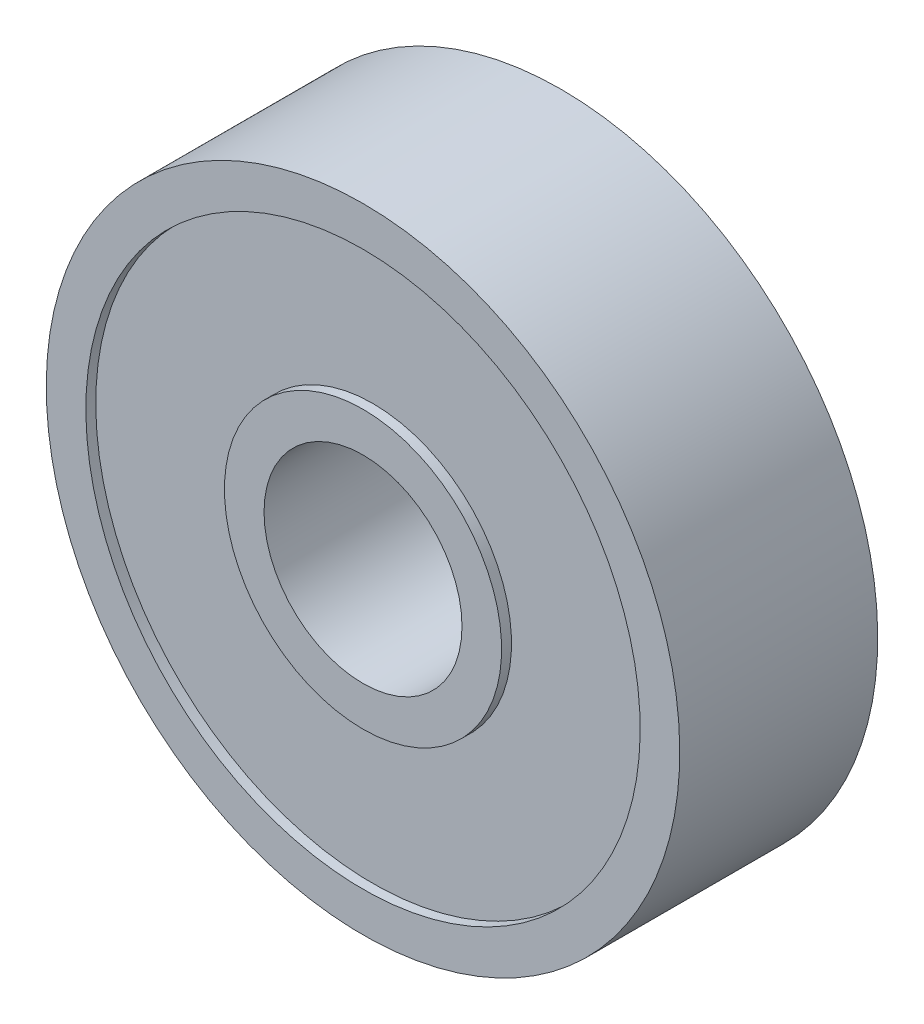
ISO-10303-21;
HEADER;
FILE_DESCRIPTION(('STEP AP214'),'2;1');
FILE_NAME('part.step','',(''),(''),'','','');
FILE_SCHEMA(('AUTOMOTIVE_DESIGN { 1 0 10303 214 1 1 1 1 }'));
ENDSEC;
DATA;
#1=APPLICATION_CONTEXT('core data for automotive mechanical design processes');
#2=APPLICATION_PROTOCOL_DEFINITION('international standard','automotive_design',2000,#1);
#3=PRODUCT_CONTEXT('',#1,'mechanical');
#4=PRODUCT('Part','Part','',(#3));
#5=PRODUCT_RELATED_PRODUCT_CATEGORY('part','',(#4));
#6=PRODUCT_DEFINITION_FORMATION('','',#4);
#7=PRODUCT_DEFINITION_CONTEXT('part definition',#1,'design');
#8=PRODUCT_DEFINITION('design','',#6,#7);
#9=PRODUCT_DEFINITION_SHAPE('','',#8);
#10=(LENGTH_UNIT() NAMED_UNIT(*) SI_UNIT(.MILLI.,.METRE.));
#11=(NAMED_UNIT(*) PLANE_ANGLE_UNIT() SI_UNIT($,.RADIAN.));
#12=(NAMED_UNIT(*) SI_UNIT($,.STERADIAN.) SOLID_ANGLE_UNIT());
#13=UNCERTAINTY_MEASURE_WITH_UNIT(LENGTH_MEASURE(1.E-05),#10,'distance_accuracy_value','');
#14=(GEOMETRIC_REPRESENTATION_CONTEXT(3) GLOBAL_UNCERTAINTY_ASSIGNED_CONTEXT((#13)) GLOBAL_UNIT_ASSIGNED_CONTEXT((#10,
#11,#12)) REPRESENTATION_CONTEXT('',''));
#15=CARTESIAN_POINT('',(0.,0.,0.));
#16=DIRECTION('',(0.,0.,1.));
#17=DIRECTION('',(1.,0.,0.));
#18=AXIS2_PLACEMENT_3D('',#15,#16,#17);
#19=CARTESIAN_POINT('',(0.,0.,2.5));
#20=DIRECTION('',(0.,0.,-1.));
#21=DIRECTION('',(0.,1.,0.));
#22=AXIS2_PLACEMENT_3D('',#19,#20,#21);
#23=CYLINDRICAL_SURFACE('',#22,2.5);
#24=CARTESIAN_POINT('',(0.,0.,0.));
#25=DIRECTION('',(0.,0.,-1.));
#26=DIRECTION('',(1.,0.,0.));
#27=AXIS2_PLACEMENT_3D('',#24,#25,#26);
#28=CIRCLE('',#27,2.5);
#29=CARTESIAN_POINT('',(0.,2.5,0.));
#30=VERTEX_POINT('',#29);
#31=EDGE_CURVE('E11',#30,#30,#28,.T.);
#32=ORIENTED_EDGE('',*,*,#31,.T.);
#33=EDGE_LOOP('',(#32));
#34=FACE_BOUND('',#33,.T.);
#35=CARTESIAN_POINT('',(0.,0.,5.));
#36=DIRECTION('',(0.,0.,-1.));
#37=DIRECTION('',(1.,0.,0.));
#38=AXIS2_PLACEMENT_3D('',#35,#36,#37);
#39=CIRCLE('',#38,2.5);
#40=CARTESIAN_POINT('',(0.,2.5,5.));
#41=VERTEX_POINT('',#40);
#42=EDGE_CURVE('E90',#41,#41,#39,.T.);
#43=ORIENTED_EDGE('',*,*,#42,.F.);
#44=EDGE_LOOP('',(#43));
#45=FACE_BOUND('',#44,.T.);
#46=ADVANCED_FACE('F17',(#34,#45),#23,.F.);
#47=CARTESIAN_POINT('',(0.,2.5,0.));
#48=DIRECTION('',(0.,0.,-1.));
#49=DIRECTION('',(0.,-1.,0.));
#50=AXIS2_PLACEMENT_3D('',#47,#48,#49);
#51=PLANE('',#50);
#52=CARTESIAN_POINT('',(0.,0.,0.));
#53=DIRECTION('',(0.,0.,-1.));
#54=DIRECTION('',(1.,0.,0.));
#55=AXIS2_PLACEMENT_3D('',#52,#53,#54);
#56=CIRCLE('',#55,3.5);
#57=CARTESIAN_POINT('',(0.,3.5,0.));
#58=VERTEX_POINT('',#57);
#59=EDGE_CURVE('E27',#58,#58,#56,.T.);
#60=ORIENTED_EDGE('',*,*,#59,.T.);
#61=EDGE_LOOP('',(#60));
#62=FACE_BOUND('',#61,.T.);
#63=ORIENTED_EDGE('',*,*,#31,.F.);
#64=EDGE_LOOP('',(#63));
#65=FACE_BOUND('',#64,.T.);
#66=ADVANCED_FACE('F122',(#62,#65),#51,.T.);
#67=CARTESIAN_POINT('',(0.,0.,0.125));
#68=DIRECTION('',(0.,0.,-1.));
#69=DIRECTION('',(0.,1.,0.));
#70=AXIS2_PLACEMENT_3D('',#67,#68,#69);
#71=CYLINDRICAL_SURFACE('',#70,3.5);
#72=CARTESIAN_POINT('',(0.,0.,0.25));
#73=DIRECTION('',(0.,0.,-1.));
#74=DIRECTION('',(1.,0.,0.));
#75=AXIS2_PLACEMENT_3D('',#72,#73,#74);
#76=CIRCLE('',#75,3.5);
#77=CARTESIAN_POINT('',(0.,3.5,0.25));
#78=VERTEX_POINT('',#77);
#79=EDGE_CURVE('E53',#78,#78,#76,.T.);
#80=ORIENTED_EDGE('',*,*,#79,.T.);
#81=EDGE_LOOP('',(#80));
#82=FACE_BOUND('',#81,.T.);
#83=ORIENTED_EDGE('',*,*,#59,.F.);
#84=EDGE_LOOP('',(#83));
#85=FACE_BOUND('',#84,.T.);
#86=ADVANCED_FACE('F54',(#82,#85),#71,.T.);
#87=CARTESIAN_POINT('',(0.,3.5,0.25));
#88=DIRECTION('',(0.,0.,-1.));
#89=DIRECTION('',(0.,-1.,0.));
#90=AXIS2_PLACEMENT_3D('',#87,#88,#89);
#91=PLANE('',#90);
#92=CARTESIAN_POINT('',(0.,0.,0.25));
#93=DIRECTION('',(0.,0.,-1.));
#94=DIRECTION('',(1.,0.,0.));
#95=AXIS2_PLACEMENT_3D('',#92,#93,#94);
#96=CIRCLE('',#95,7.);
#97=CARTESIAN_POINT('',(0.,7.,0.25));
#98=VERTEX_POINT('',#97);
#99=EDGE_CURVE('E56',#98,#98,#96,.T.);
#100=ORIENTED_EDGE('',*,*,#99,.T.);
#101=EDGE_LOOP('',(#100));
#102=FACE_BOUND('',#101,.T.);
#103=ORIENTED_EDGE('',*,*,#79,.F.);
#104=EDGE_LOOP('',(#103));
#105=FACE_BOUND('',#104,.T.);
#106=ADVANCED_FACE('F172',(#102,#105),#91,.T.);
#107=CARTESIAN_POINT('',(0.,0.,0.125000000000002));
#108=DIRECTION('',(0.,0.,-1.));
#109=DIRECTION('',(0.,1.,0.));
#110=AXIS2_PLACEMENT_3D('',#107,#108,#109);
#111=CYLINDRICAL_SURFACE('',#110,7.);
#112=CARTESIAN_POINT('',(0.,0.,0.));
#113=DIRECTION('',(0.,0.,-1.));
#114=DIRECTION('',(1.,0.,0.));
#115=AXIS2_PLACEMENT_3D('',#112,#113,#114);
#116=CIRCLE('',#115,7.);
#117=CARTESIAN_POINT('',(0.,7.,0.));
#118=VERTEX_POINT('',#117);
#119=EDGE_CURVE('E67',#118,#118,#116,.T.);
#120=ORIENTED_EDGE('',*,*,#119,.T.);
#121=EDGE_LOOP('',(#120));
#122=FACE_BOUND('',#121,.T.);
#123=ORIENTED_EDGE('',*,*,#99,.F.);
#124=EDGE_LOOP('',(#123));
#125=FACE_BOUND('',#124,.T.);
#126=ADVANCED_FACE('F166',(#122,#125),#111,.F.);
#127=CARTESIAN_POINT('',(0.,7.,0.));
#128=DIRECTION('',(0.,0.,-1.));
#129=DIRECTION('',(0.,-1.,0.));
#130=AXIS2_PLACEMENT_3D('',#127,#128,#129);
#131=PLANE('',#130);
#132=CARTESIAN_POINT('',(0.,0.,0.));
#133=DIRECTION('',(0.,0.,-1.));
#134=DIRECTION('',(1.,0.,0.));
#135=AXIS2_PLACEMENT_3D('',#132,#133,#134);
#136=CIRCLE('',#135,8.);
#137=CARTESIAN_POINT('',(0.,8.,0.));
#138=VERTEX_POINT('',#137);
#139=EDGE_CURVE('E73',#138,#138,#136,.T.);
#140=ORIENTED_EDGE('',*,*,#139,.T.);
#141=EDGE_LOOP('',(#140));
#142=FACE_BOUND('',#141,.T.);
#143=ORIENTED_EDGE('',*,*,#119,.F.);
#144=EDGE_LOOP('',(#143));
#145=FACE_BOUND('',#144,.T.);
#146=ADVANCED_FACE('F162',(#142,#145),#131,.T.);
#147=CARTESIAN_POINT('',(0.,0.,2.5));
#148=DIRECTION('',(0.,0.,-1.));
#149=DIRECTION('',(0.,1.,0.));
#150=AXIS2_PLACEMENT_3D('',#147,#148,#149);
#151=CYLINDRICAL_SURFACE('',#150,8.);
#152=CARTESIAN_POINT('',(0.,0.,5.));
#153=DIRECTION('',(0.,0.,-1.));
#154=DIRECTION('',(1.,0.,0.));
#155=AXIS2_PLACEMENT_3D('',#152,#153,#154);
#156=CIRCLE('',#155,8.);
#157=CARTESIAN_POINT('',(0.,8.,5.));
#158=VERTEX_POINT('',#157);
#159=EDGE_CURVE('E66',#158,#158,#156,.T.);
#160=ORIENTED_EDGE('',*,*,#159,.T.);
#161=EDGE_LOOP('',(#160));
#162=FACE_BOUND('',#161,.T.);
#163=ORIENTED_EDGE('',*,*,#139,.F.);
#164=EDGE_LOOP('',(#163));
#165=FACE_BOUND('',#164,.T.);
#166=ADVANCED_FACE('F149',(#162,#165),#151,.T.);
#167=CARTESIAN_POINT('',(0.,8.,5.));
#168=DIRECTION('',(0.,0.,1.));
#169=DIRECTION('',(1.,0.,0.));
#170=AXIS2_PLACEMENT_3D('',#167,#168,#169);
#171=PLANE('',#170);
#172=CARTESIAN_POINT('',(0.,0.,5.));
#173=DIRECTION('',(0.,0.,-1.));
#174=DIRECTION('',(1.,0.,0.));
#175=AXIS2_PLACEMENT_3D('',#172,#173,#174);
#176=CIRCLE('',#175,7.);
#177=CARTESIAN_POINT('',(0.,7.,5.));
#178=VERTEX_POINT('',#177);
#179=EDGE_CURVE('E72',#178,#178,#176,.T.);
#180=ORIENTED_EDGE('',*,*,#179,.T.);
#181=EDGE_LOOP('',(#180));
#182=FACE_BOUND('',#181,.T.);
#183=ORIENTED_EDGE('',*,*,#159,.F.);
#184=EDGE_LOOP('',(#183));
#185=FACE_BOUND('',#184,.T.);
#186=ADVANCED_FACE('F155',(#182,#185),#171,.T.);
#187=CARTESIAN_POINT('',(0.,0.,4.875));
#188=DIRECTION('',(0.,0.,-1.));
#189=DIRECTION('',(0.,1.,0.));
#190=AXIS2_PLACEMENT_3D('',#187,#188,#189);
#191=CYLINDRICAL_SURFACE('',#190,7.);
#192=CARTESIAN_POINT('',(0.,0.,4.75));
#193=DIRECTION('',(0.,0.,-1.));
#194=DIRECTION('',(1.,0.,0.));
#195=AXIS2_PLACEMENT_3D('',#192,#193,#194);
#196=CIRCLE('',#195,7.);
#197=CARTESIAN_POINT('',(0.,7.,4.75));
#198=VERTEX_POINT('',#197);
#199=EDGE_CURVE('E77',#198,#198,#196,.T.);
#200=ORIENTED_EDGE('',*,*,#199,.T.);
#201=EDGE_LOOP('',(#200));
#202=FACE_BOUND('',#201,.T.);
#203=ORIENTED_EDGE('',*,*,#179,.F.);
#204=EDGE_LOOP('',(#203));
#205=FACE_BOUND('',#204,.T.);
#206=ADVANCED_FACE('F152',(#202,#205),#191,.F.);
#207=CARTESIAN_POINT('',(0.,7.,4.75));
#208=DIRECTION('',(0.,0.,1.));
#209=DIRECTION('',(1.,0.,0.));
#210=AXIS2_PLACEMENT_3D('',#207,#208,#209);
#211=PLANE('',#210);
#212=CARTESIAN_POINT('',(0.,0.,4.75));
#213=DIRECTION('',(0.,0.,-1.));
#214=DIRECTION('',(1.,0.,0.));
#215=AXIS2_PLACEMENT_3D('',#212,#213,#214);
#216=CIRCLE('',#215,3.5);
#217=CARTESIAN_POINT('',(0.,3.5,4.75));
#218=VERTEX_POINT('',#217);
#219=EDGE_CURVE('E81',#218,#218,#216,.T.);
#220=ORIENTED_EDGE('',*,*,#219,.T.);
#221=EDGE_LOOP('',(#220));
#222=FACE_BOUND('',#221,.T.);
#223=ORIENTED_EDGE('',*,*,#199,.F.);
#224=EDGE_LOOP('',(#223));
#225=FACE_BOUND('',#224,.T.);
#226=ADVANCED_FACE('F119',(#222,#225),#211,.T.);
#227=CARTESIAN_POINT('',(0.,0.,4.875));
#228=DIRECTION('',(0.,0.,-1.));
#229=DIRECTION('',(0.,1.,0.));
#230=AXIS2_PLACEMENT_3D('',#227,#228,#229);
#231=CYLINDRICAL_SURFACE('',#230,3.5);
#232=CARTESIAN_POINT('',(0.,0.,5.));
#233=DIRECTION('',(0.,0.,-1.));
#234=DIRECTION('',(1.,0.,0.));
#235=AXIS2_PLACEMENT_3D('',#232,#233,#234);
#236=CIRCLE('',#235,3.5);
#237=CARTESIAN_POINT('',(0.,3.5,5.));
#238=VERTEX_POINT('',#237);
#239=EDGE_CURVE('E91',#238,#238,#236,.T.);
#240=ORIENTED_EDGE('',*,*,#239,.T.);
#241=EDGE_LOOP('',(#240));
#242=FACE_BOUND('',#241,.T.);
#243=ORIENTED_EDGE('',*,*,#219,.F.);
#244=EDGE_LOOP('',(#243));
#245=FACE_BOUND('',#244,.T.);
#246=ADVANCED_FACE('F103',(#242,#245),#231,.T.);
#247=CARTESIAN_POINT('',(0.,3.5,5.));
#248=DIRECTION('',(0.,0.,1.));
#249=DIRECTION('',(1.,0.,0.));
#250=AXIS2_PLACEMENT_3D('',#247,#248,#249);
#251=PLANE('',#250);
#252=ORIENTED_EDGE('',*,*,#42,.T.);
#253=EDGE_LOOP('',(#252));
#254=FACE_BOUND('',#253,.T.);
#255=ORIENTED_EDGE('',*,*,#239,.F.);
#256=EDGE_LOOP('',(#255));
#257=FACE_BOUND('',#256,.T.);
#258=ADVANCED_FACE('F108',(#254,#257),#251,.T.);
#259=CLOSED_SHELL('',(#46,#66,#86,#106,#126,#146,#166,#186,#206,#226,#246,#258));
#260=MANIFOLD_SOLID_BREP('B1',#259);
#261=ADVANCED_BREP_SHAPE_REPRESENTATION('',(#18,#260),#14);
#262=SHAPE_DEFINITION_REPRESENTATION(#9,#261);
ENDSEC;
END-ISO-10303-21;
